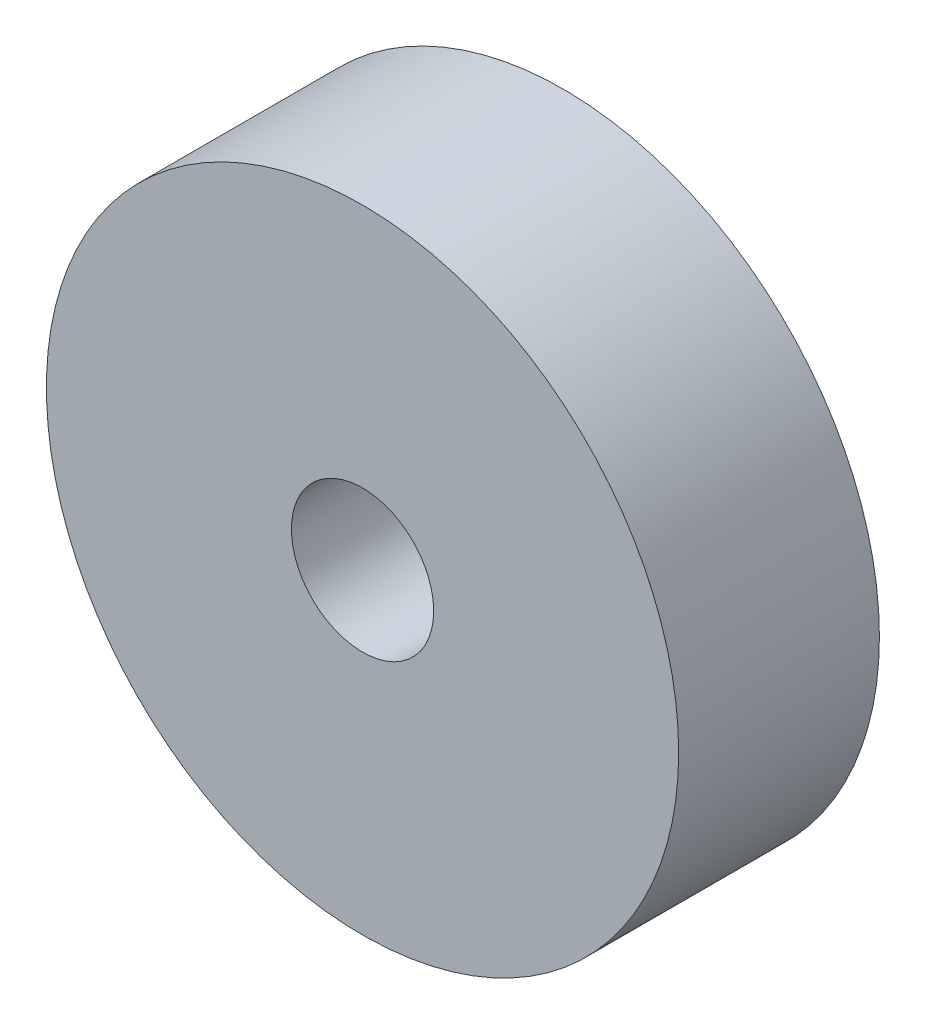
ISO-10303-21;
HEADER;
FILE_DESCRIPTION(('STEP AP214'),'2;1');
FILE_NAME('part.step','',(''),(''),'','','');
FILE_SCHEMA(('AUTOMOTIVE_DESIGN { 1 0 10303 214 1 1 1 1 }'));
ENDSEC;
DATA;
#1=APPLICATION_CONTEXT('core data for automotive mechanical design processes');
#2=APPLICATION_PROTOCOL_DEFINITION('international standard','automotive_design',2000,#1);
#3=PRODUCT_CONTEXT('',#1,'mechanical');
#4=PRODUCT('Part','Part','',(#3));
#5=PRODUCT_RELATED_PRODUCT_CATEGORY('part','',(#4));
#6=PRODUCT_DEFINITION_FORMATION('','',#4);
#7=PRODUCT_DEFINITION_CONTEXT('part definition',#1,'design');
#8=PRODUCT_DEFINITION('design','',#6,#7);
#9=PRODUCT_DEFINITION_SHAPE('','',#8);
#10=(LENGTH_UNIT() NAMED_UNIT(*) SI_UNIT(.MILLI.,.METRE.));
#11=(NAMED_UNIT(*) PLANE_ANGLE_UNIT() SI_UNIT($,.RADIAN.));
#12=(NAMED_UNIT(*) SI_UNIT($,.STERADIAN.) SOLID_ANGLE_UNIT());
#13=UNCERTAINTY_MEASURE_WITH_UNIT(LENGTH_MEASURE(1.E-05),#10,'distance_accuracy_value','');
#14=(GEOMETRIC_REPRESENTATION_CONTEXT(3) GLOBAL_UNCERTAINTY_ASSIGNED_CONTEXT((#13)) GLOBAL_UNIT_ASSIGNED_CONTEXT((#10,
#11,#12)) REPRESENTATION_CONTEXT('',''));
#15=CARTESIAN_POINT('',(0.,0.,0.));
#16=DIRECTION('',(0.,0.,1.));
#17=DIRECTION('',(1.,0.,0.));
#18=AXIS2_PLACEMENT_3D('',#15,#16,#17);
#19=CARTESIAN_POINT('',(0.,0.,6.35));
#20=DIRECTION('',(0.,0.,1.));
#21=DIRECTION('',(1.,0.,0.));
#22=AXIS2_PLACEMENT_3D('',#19,#20,#21);
#23=PLANE('',#22);
#24=CARTESIAN_POINT('',(0.,0.,6.35));
#25=DIRECTION('',(0.,0.,1.));
#26=DIRECTION('',(1.,0.,0.));
#27=AXIS2_PLACEMENT_3D('',#24,#25,#26);
#28=CIRCLE('',#27,10.);
#29=CARTESIAN_POINT('',(10.,0.,6.35));
#30=VERTEX_POINT('',#29);
#31=EDGE_CURVE('E10',#30,#30,#28,.T.);
#32=ORIENTED_EDGE('',*,*,#31,.T.);
#33=EDGE_LOOP('',(#32));
#34=FACE_BOUND('',#33,.T.);
#35=CARTESIAN_POINT('',(0.,0.,6.35));
#36=DIRECTION('',(0.,0.,1.));
#37=DIRECTION('',(1.,0.,0.));
#38=AXIS2_PLACEMENT_3D('',#35,#36,#37);
#39=CIRCLE('',#38,2.250000056);
#40=CARTESIAN_POINT('',(2.250000056,0.,6.35));
#41=VERTEX_POINT('',#40);
#42=EDGE_CURVE('E49',#41,#41,#39,.T.);
#43=ORIENTED_EDGE('',*,*,#42,.F.);
#44=EDGE_LOOP('',(#43));
#45=FACE_BOUND('',#44,.T.);
#46=ADVANCED_FACE('F39',(#34,#45),#23,.T.);
#47=CARTESIAN_POINT('',(0.,0.,0.));
#48=DIRECTION('',(0.,0.,1.));
#49=DIRECTION('',(1.,0.,0.));
#50=AXIS2_PLACEMENT_3D('',#47,#48,#49);
#51=PLANE('',#50);
#52=CARTESIAN_POINT('',(0.,0.,0.));
#53=DIRECTION('',(0.,0.,1.));
#54=DIRECTION('',(1.,0.,0.));
#55=AXIS2_PLACEMENT_3D('',#52,#53,#54);
#56=CIRCLE('',#55,10.);
#57=CARTESIAN_POINT('',(10.,0.,0.));
#58=VERTEX_POINT('',#57);
#59=EDGE_CURVE('E43',#58,#58,#56,.T.);
#60=ORIENTED_EDGE('',*,*,#59,.F.);
#61=EDGE_LOOP('',(#60));
#62=FACE_BOUND('',#61,.T.);
#63=CARTESIAN_POINT('',(0.,0.,0.));
#64=DIRECTION('',(0.,0.,1.));
#65=DIRECTION('',(1.,0.,0.));
#66=AXIS2_PLACEMENT_3D('',#63,#64,#65);
#67=CIRCLE('',#66,2.250000056);
#68=CARTESIAN_POINT('',(2.250000056,0.,0.));
#69=VERTEX_POINT('',#68);
#70=EDGE_CURVE('E55',#69,#69,#67,.T.);
#71=ORIENTED_EDGE('',*,*,#70,.T.);
#72=EDGE_LOOP('',(#71));
#73=FACE_BOUND('',#72,.T.);
#74=ADVANCED_FACE('F64',(#62,#73),#51,.F.);
#75=CARTESIAN_POINT('',(0.,0.,6.35));
#76=DIRECTION('',(0.,0.,-1.));
#77=DIRECTION('',(-1.,0.,0.));
#78=AXIS2_PLACEMENT_3D('',#75,#76,#77);
#79=CYLINDRICAL_SURFACE('',#78,10.);
#80=ORIENTED_EDGE('',*,*,#31,.F.);
#81=EDGE_LOOP('',(#80));
#82=FACE_BOUND('',#81,.T.);
#83=ORIENTED_EDGE('',*,*,#59,.T.);
#84=EDGE_LOOP('',(#83));
#85=FACE_BOUND('',#84,.T.);
#86=ADVANCED_FACE('F41',(#82,#85),#79,.T.);
#87=CARTESIAN_POINT('',(0.,0.,6.35));
#88=DIRECTION('',(0.,0.,-1.));
#89=DIRECTION('',(-1.,0.,0.));
#90=AXIS2_PLACEMENT_3D('',#87,#88,#89);
#91=CYLINDRICAL_SURFACE('',#90,2.250000056);
#92=ORIENTED_EDGE('',*,*,#42,.T.);
#93=EDGE_LOOP('',(#92));
#94=FACE_BOUND('',#93,.T.);
#95=ORIENTED_EDGE('',*,*,#70,.F.);
#96=EDGE_LOOP('',(#95));
#97=FACE_BOUND('',#96,.T.);
#98=ADVANCED_FACE('F59',(#94,#97),#91,.F.);
#99=CLOSED_SHELL('',(#46,#74,#86,#98));
#100=MANIFOLD_SOLID_BREP('B2',#99);
#101=ADVANCED_BREP_SHAPE_REPRESENTATION('',(#18,#100),#14);
#102=SHAPE_DEFINITION_REPRESENTATION(#9,#101);
ENDSEC;
END-ISO-10303-21;
